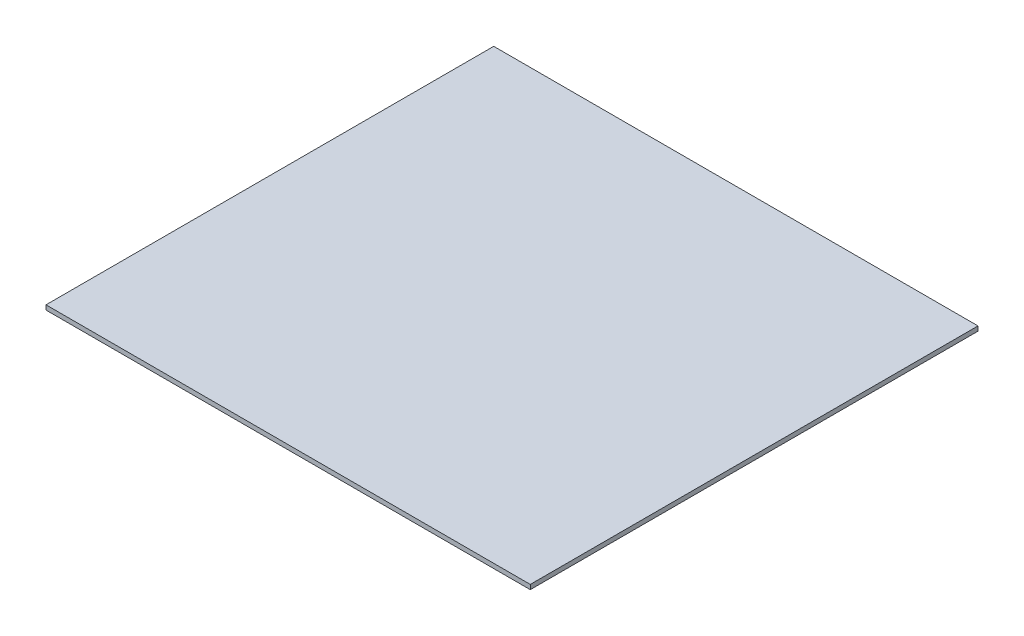
ISO-10303-21;
HEADER;
FILE_DESCRIPTION(('STEP AP214'),'2;1');
FILE_NAME('part.step','',(''),(''),'','','');
FILE_SCHEMA(('AUTOMOTIVE_DESIGN { 1 0 10303 214 1 1 1 1 }'));
ENDSEC;
DATA;
#1=APPLICATION_CONTEXT('core data for automotive mechanical design processes');
#2=APPLICATION_PROTOCOL_DEFINITION('international standard','automotive_design',2000,#1);
#3=PRODUCT_CONTEXT('',#1,'mechanical');
#4=PRODUCT('Part','Part','',(#3));
#5=PRODUCT_RELATED_PRODUCT_CATEGORY('part','',(#4));
#6=PRODUCT_DEFINITION_FORMATION('','',#4);
#7=PRODUCT_DEFINITION_CONTEXT('part definition',#1,'design');
#8=PRODUCT_DEFINITION('design','',#6,#7);
#9=PRODUCT_DEFINITION_SHAPE('','',#8);
#10=(LENGTH_UNIT() NAMED_UNIT(*) SI_UNIT(.MILLI.,.METRE.));
#11=(NAMED_UNIT(*) PLANE_ANGLE_UNIT() SI_UNIT($,.RADIAN.));
#12=(NAMED_UNIT(*) SI_UNIT($,.STERADIAN.) SOLID_ANGLE_UNIT());
#13=UNCERTAINTY_MEASURE_WITH_UNIT(LENGTH_MEASURE(1.E-05),#10,'distance_accuracy_value','');
#14=(GEOMETRIC_REPRESENTATION_CONTEXT(3) GLOBAL_UNCERTAINTY_ASSIGNED_CONTEXT((#13)) GLOBAL_UNIT_ASSIGNED_CONTEXT((#10,
#11,#12)) REPRESENTATION_CONTEXT('',''));
#15=CARTESIAN_POINT('',(0.,0.,0.));
#16=DIRECTION('',(0.,0.,1.));
#17=DIRECTION('',(1.,0.,0.));
#18=AXIS2_PLACEMENT_3D('',#15,#16,#17);
#19=CARTESIAN_POINT('',(-53.,1.,-49.));
#20=DIRECTION('',(1.,0.,0.));
#21=DIRECTION('',(0.,0.,-1.));
#22=AXIS2_PLACEMENT_3D('',#19,#20,#21);
#23=PLANE('',#22);
#24=DIRECTION('',(0.,0.,1.));
#25=VECTOR('',#24,1.);
#26=CARTESIAN_POINT('',(-53.,0.,-49.));
#27=LINE('',#26,#25);
#28=CARTESIAN_POINT('',(-53.,0.,-49.));
#29=VERTEX_POINT('',#28);
#30=CARTESIAN_POINT('',(-53.,0.,49.));
#31=VERTEX_POINT('',#30);
#32=EDGE_CURVE('E111',#29,#31,#27,.T.);
#33=ORIENTED_EDGE('',*,*,#32,.T.);
#34=DIRECTION('',(0.,-1.,0.));
#35=VECTOR('',#34,1.);
#36=CARTESIAN_POINT('',(-53.,1.,49.));
#37=LINE('',#36,#35);
#38=CARTESIAN_POINT('',(-53.,1.,49.));
#39=VERTEX_POINT('',#38);
#40=EDGE_CURVE('E11',#39,#31,#37,.T.);
#41=ORIENTED_EDGE('',*,*,#40,.F.);
#42=DIRECTION('',(0.,0.,1.));
#43=VECTOR('',#42,1.);
#44=CARTESIAN_POINT('',(-53.,1.,-49.));
#45=LINE('',#44,#43);
#46=CARTESIAN_POINT('',(-53.,1.,-49.));
#47=VERTEX_POINT('',#46);
#48=EDGE_CURVE('E95',#47,#39,#45,.T.);
#49=ORIENTED_EDGE('',*,*,#48,.F.);
#50=DIRECTION('',(0.,-1.,0.));
#51=VECTOR('',#50,1.);
#52=CARTESIAN_POINT('',(-53.,1.,-49.));
#53=LINE('',#52,#51);
#54=EDGE_CURVE('E107',#47,#29,#53,.T.);
#55=ORIENTED_EDGE('',*,*,#54,.T.);
#56=EDGE_LOOP('',(#33,#41,#49,#55));
#57=FACE_BOUND('',#56,.T.);
#58=ADVANCED_FACE('F43',(#57),#23,.F.);
#59=CARTESIAN_POINT('',(-53.,1.,49.));
#60=DIRECTION('',(0.,0.,-1.));
#61=DIRECTION('',(-1.,0.,0.));
#62=AXIS2_PLACEMENT_3D('',#59,#60,#61);
#63=PLANE('',#62);
#64=DIRECTION('',(1.,0.,0.));
#65=VECTOR('',#64,1.);
#66=CARTESIAN_POINT('',(-53.,0.,49.));
#67=LINE('',#66,#65);
#68=CARTESIAN_POINT('',(53.,0.,49.));
#69=VERTEX_POINT('',#68);
#70=EDGE_CURVE('E100',#31,#69,#67,.T.);
#71=ORIENTED_EDGE('',*,*,#70,.T.);
#72=DIRECTION('',(0.,-1.,0.));
#73=VECTOR('',#72,1.);
#74=CARTESIAN_POINT('',(53.,1.,49.));
#75=LINE('',#74,#73);
#76=CARTESIAN_POINT('',(53.,1.,49.));
#77=VERTEX_POINT('',#76);
#78=EDGE_CURVE('E52',#77,#69,#75,.T.);
#79=ORIENTED_EDGE('',*,*,#78,.F.);
#80=DIRECTION('',(1.,0.,0.));
#81=VECTOR('',#80,1.);
#82=CARTESIAN_POINT('',(-53.,1.,49.));
#83=LINE('',#82,#81);
#84=EDGE_CURVE('E90',#39,#77,#83,.T.);
#85=ORIENTED_EDGE('',*,*,#84,.F.);
#86=ORIENTED_EDGE('',*,*,#40,.T.);
#87=EDGE_LOOP('',(#71,#79,#85,#86));
#88=FACE_BOUND('',#87,.T.);
#89=ADVANCED_FACE('F99',(#88),#63,.F.);
#90=CARTESIAN_POINT('',(53.,1.,-49.));
#91=DIRECTION('',(-1.,0.,0.));
#92=DIRECTION('',(0.,0.,1.));
#93=AXIS2_PLACEMENT_3D('',#90,#91,#92);
#94=PLANE('',#93);
#95=DIRECTION('',(0.,0.,-1.));
#96=VECTOR('',#95,1.);
#97=CARTESIAN_POINT('',(53.,0.,-49.));
#98=LINE('',#97,#96);
#99=CARTESIAN_POINT('',(53.,0.,-49.));
#100=VERTEX_POINT('',#99);
#101=EDGE_CURVE('E77',#69,#100,#98,.T.);
#102=ORIENTED_EDGE('',*,*,#101,.T.);
#103=DIRECTION('',(0.,-1.,0.));
#104=VECTOR('',#103,1.);
#105=CARTESIAN_POINT('',(53.,1.,-49.));
#106=LINE('',#105,#104);
#107=CARTESIAN_POINT('',(53.,1.,-49.));
#108=VERTEX_POINT('',#107);
#109=EDGE_CURVE('E102',#108,#100,#106,.T.);
#110=ORIENTED_EDGE('',*,*,#109,.F.);
#111=DIRECTION('',(0.,0.,-1.));
#112=VECTOR('',#111,1.);
#113=CARTESIAN_POINT('',(53.,1.,-49.));
#114=LINE('',#113,#112);
#115=EDGE_CURVE('E93',#77,#108,#114,.T.);
#116=ORIENTED_EDGE('',*,*,#115,.F.);
#117=ORIENTED_EDGE('',*,*,#78,.T.);
#118=EDGE_LOOP('',(#102,#110,#116,#117));
#119=FACE_BOUND('',#118,.T.);
#120=ADVANCED_FACE('F103',(#119),#94,.F.);
#121=CARTESIAN_POINT('',(-53.,1.,-49.));
#122=DIRECTION('',(0.,0.,1.));
#123=DIRECTION('',(1.,0.,0.));
#124=AXIS2_PLACEMENT_3D('',#121,#122,#123);
#125=PLANE('',#124);
#126=DIRECTION('',(-1.,0.,0.));
#127=VECTOR('',#126,1.);
#128=CARTESIAN_POINT('',(-53.,0.,-49.));
#129=LINE('',#128,#127);
#130=EDGE_CURVE('E83',#100,#29,#129,.T.);
#131=ORIENTED_EDGE('',*,*,#130,.T.);
#132=ORIENTED_EDGE('',*,*,#54,.F.);
#133=DIRECTION('',(-1.,0.,0.));
#134=VECTOR('',#133,1.);
#135=CARTESIAN_POINT('',(-53.,1.,-49.));
#136=LINE('',#135,#134);
#137=EDGE_CURVE('E60',#108,#47,#136,.T.);
#138=ORIENTED_EDGE('',*,*,#137,.F.);
#139=ORIENTED_EDGE('',*,*,#109,.T.);
#140=EDGE_LOOP('',(#131,#132,#138,#139));
#141=FACE_BOUND('',#140,.T.);
#142=ADVANCED_FACE('F124',(#141),#125,.F.);
#143=CARTESIAN_POINT('',(0.,1.,0.));
#144=DIRECTION('',(0.,1.,0.));
#145=DIRECTION('',(0.,0.,1.));
#146=AXIS2_PLACEMENT_3D('',#143,#144,#145);
#147=PLANE('',#146);
#148=ORIENTED_EDGE('',*,*,#48,.T.);
#149=ORIENTED_EDGE('',*,*,#84,.T.);
#150=ORIENTED_EDGE('',*,*,#115,.T.);
#151=ORIENTED_EDGE('',*,*,#137,.T.);
#152=EDGE_LOOP('',(#148,#149,#150,#151));
#153=FACE_BOUND('',#152,.T.);
#154=ADVANCED_FACE('F91',(#153),#147,.T.);
#155=CARTESIAN_POINT('',(0.,0.,0.));
#156=DIRECTION('',(0.,1.,0.));
#157=DIRECTION('',(0.,0.,1.));
#158=AXIS2_PLACEMENT_3D('',#155,#156,#157);
#159=PLANE('',#158);
#160=ORIENTED_EDGE('',*,*,#32,.F.);
#161=ORIENTED_EDGE('',*,*,#130,.F.);
#162=ORIENTED_EDGE('',*,*,#101,.F.);
#163=ORIENTED_EDGE('',*,*,#70,.F.);
#164=EDGE_LOOP('',(#160,#161,#162,#163));
#165=FACE_BOUND('',#164,.T.);
#166=ADVANCED_FACE('F127',(#165),#159,.F.);
#167=CLOSED_SHELL('',(#58,#89,#120,#142,#154,#166));
#168=MANIFOLD_SOLID_BREP('B2',#167);
#169=ADVANCED_BREP_SHAPE_REPRESENTATION('',(#18,#168),#14);
#170=SHAPE_DEFINITION_REPRESENTATION(#9,#169);
ENDSEC;
END-ISO-10303-21;
